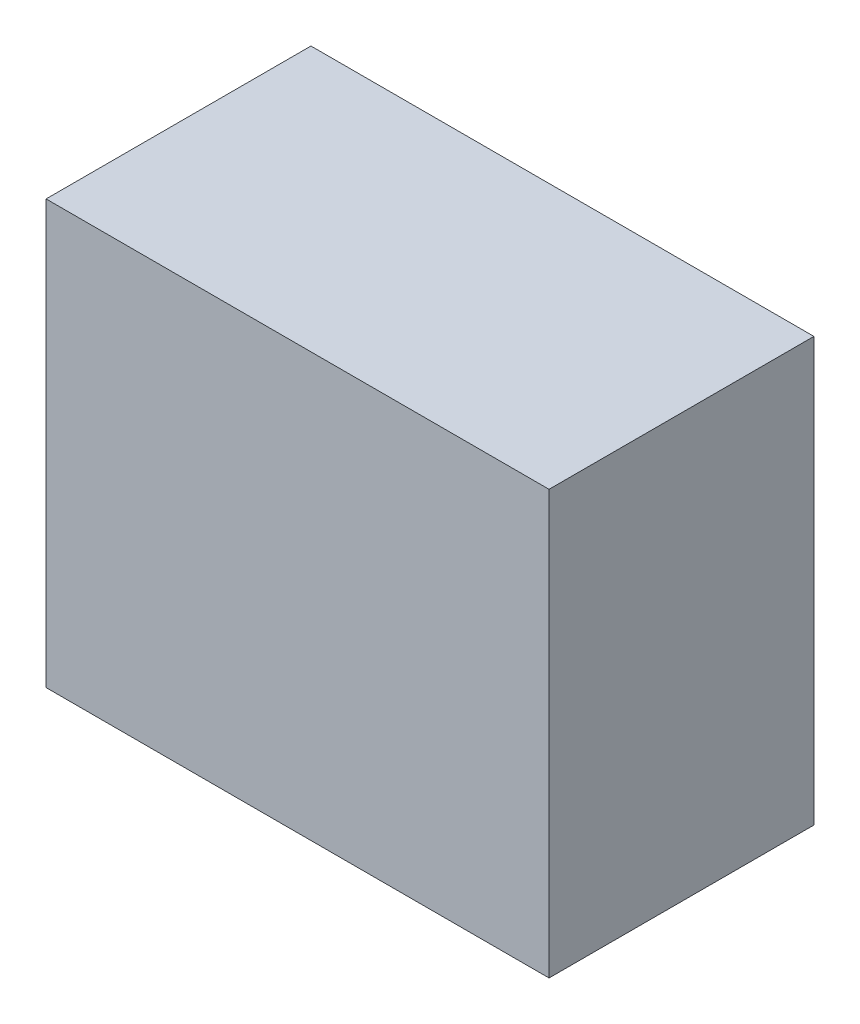
ISO-10303-21;
HEADER;
FILE_DESCRIPTION(('STEP AP214'),'2;1');
FILE_NAME('part.step','',(''),(''),'','','');
FILE_SCHEMA(('AUTOMOTIVE_DESIGN { 1 0 10303 214 1 1 1 1 }'));
ENDSEC;
DATA;
#1=APPLICATION_CONTEXT('core data for automotive mechanical design processes');
#2=APPLICATION_PROTOCOL_DEFINITION('international standard','automotive_design',2000,#1);
#3=PRODUCT_CONTEXT('',#1,'mechanical');
#4=PRODUCT('Part','Part','',(#3));
#5=PRODUCT_RELATED_PRODUCT_CATEGORY('part','',(#4));
#6=PRODUCT_DEFINITION_FORMATION('','',#4);
#7=PRODUCT_DEFINITION_CONTEXT('part definition',#1,'design');
#8=PRODUCT_DEFINITION('design','',#6,#7);
#9=PRODUCT_DEFINITION_SHAPE('','',#8);
#10=(LENGTH_UNIT() NAMED_UNIT(*) SI_UNIT(.MILLI.,.METRE.));
#11=(NAMED_UNIT(*) PLANE_ANGLE_UNIT() SI_UNIT($,.RADIAN.));
#12=(NAMED_UNIT(*) SI_UNIT($,.STERADIAN.) SOLID_ANGLE_UNIT());
#13=UNCERTAINTY_MEASURE_WITH_UNIT(LENGTH_MEASURE(1.E-05),#10,'distance_accuracy_value','');
#14=(GEOMETRIC_REPRESENTATION_CONTEXT(3) GLOBAL_UNCERTAINTY_ASSIGNED_CONTEXT((#13)) GLOBAL_UNIT_ASSIGNED_CONTEXT((#10,
#11,#12)) REPRESENTATION_CONTEXT('',''));
#15=CARTESIAN_POINT('',(0.,0.,0.));
#16=DIRECTION('',(0.,0.,1.));
#17=DIRECTION('',(1.,0.,0.));
#18=AXIS2_PLACEMENT_3D('',#15,#16,#17);
#19=CARTESIAN_POINT('',(-0.47474632,-0.3994912,0.50000154));
#20=DIRECTION('',(0.,0.,1.));
#21=DIRECTION('',(1.,0.,0.));
#22=AXIS2_PLACEMENT_3D('',#19,#20,#21);
#23=PLANE('',#22);
#24=DIRECTION('',(1.,0.,0.));
#25=VECTOR('',#24,1.);
#26=CARTESIAN_POINT('',(-0.47474632,0.3994912,0.50000154));
#27=LINE('',#26,#25);
#28=CARTESIAN_POINT('',(-0.47474632,0.3994912,0.50000154));
#29=VERTEX_POINT('',#28);
#30=CARTESIAN_POINT('',(0.47474632,0.3994912,0.50000154));
#31=VERTEX_POINT('',#30);
#32=EDGE_CURVE('E53',#29,#31,#27,.T.);
#33=ORIENTED_EDGE('',*,*,#32,.F.);
#34=DIRECTION('',(0.,1.,0.));
#35=VECTOR('',#34,1.);
#36=CARTESIAN_POINT('',(-0.47474632,-0.3994912,0.50000154));
#37=LINE('',#36,#35);
#38=CARTESIAN_POINT('',(-0.47474632,-0.3994912,0.50000154));
#39=VERTEX_POINT('',#38);
#40=EDGE_CURVE('E68',#39,#29,#37,.T.);
#41=ORIENTED_EDGE('',*,*,#40,.F.);
#42=DIRECTION('',(1.,0.,0.));
#43=VECTOR('',#42,1.);
#44=CARTESIAN_POINT('',(0.47474632,-0.3994912,0.50000154));
#45=LINE('',#44,#43);
#46=CARTESIAN_POINT('',(0.47474632,-0.3994912,0.50000154));
#47=VERTEX_POINT('',#46);
#48=EDGE_CURVE('E20',#47,#39,#45,.F.);
#49=ORIENTED_EDGE('',*,*,#48,.F.);
#50=DIRECTION('',(0.,1.,0.));
#51=VECTOR('',#50,1.);
#52=CARTESIAN_POINT('',(0.47474632,0.3994912,0.50000154));
#53=LINE('',#52,#51);
#54=EDGE_CURVE('E58',#31,#47,#53,.F.);
#55=ORIENTED_EDGE('',*,*,#54,.F.);
#56=EDGE_LOOP('',(#33,#41,#49,#55));
#57=FACE_BOUND('',#56,.T.);
#58=ADVANCED_FACE('F17',(#57),#23,.T.);
#59=CARTESIAN_POINT('',(0.47474632,-0.3994912,0.));
#60=DIRECTION('',(0.,-1.,0.));
#61=DIRECTION('',(0.,0.,-1.));
#62=AXIS2_PLACEMENT_3D('',#59,#60,#61);
#63=PLANE('',#62);
#64=DIRECTION('',(0.,0.,1.));
#65=VECTOR('',#64,1.);
#66=CARTESIAN_POINT('',(-0.47474632,-0.3994912,0.));
#67=LINE('',#66,#65);
#68=CARTESIAN_POINT('',(-0.47474632,-0.3994912,0.));
#69=VERTEX_POINT('',#68);
#70=EDGE_CURVE('E79',#69,#39,#67,.T.);
#71=ORIENTED_EDGE('',*,*,#70,.F.);
#72=DIRECTION('',(1.,0.,0.));
#73=VECTOR('',#72,1.);
#74=CARTESIAN_POINT('',(-0.47474632,-0.3994912,0.));
#75=LINE('',#74,#73);
#76=CARTESIAN_POINT('',(0.47474632,-0.3994912,0.));
#77=VERTEX_POINT('',#76);
#78=EDGE_CURVE('E74',#69,#77,#75,.T.);
#79=ORIENTED_EDGE('',*,*,#78,.T.);
#80=DIRECTION('',(0.,0.,-1.));
#81=VECTOR('',#80,1.);
#82=CARTESIAN_POINT('',(0.47474632,-0.3994912,0.));
#83=LINE('',#82,#81);
#84=EDGE_CURVE('E63',#47,#77,#83,.T.);
#85=ORIENTED_EDGE('',*,*,#84,.F.);
#86=ORIENTED_EDGE('',*,*,#48,.T.);
#87=EDGE_LOOP('',(#71,#79,#85,#86));
#88=FACE_BOUND('',#87,.T.);
#89=ADVANCED_FACE('F73',(#88),#63,.T.);
#90=CARTESIAN_POINT('',(0.47474632,0.3994912,0.));
#91=DIRECTION('',(1.,0.,0.));
#92=DIRECTION('',(0.,0.,-1.));
#93=AXIS2_PLACEMENT_3D('',#90,#91,#92);
#94=PLANE('',#93);
#95=ORIENTED_EDGE('',*,*,#84,.T.);
#96=DIRECTION('',(0.,1.,0.));
#97=VECTOR('',#96,1.);
#98=CARTESIAN_POINT('',(0.47474632,-0.3994912,0.));
#99=LINE('',#98,#97);
#100=CARTESIAN_POINT('',(0.47474632,0.3994912,0.));
#101=VERTEX_POINT('',#100);
#102=EDGE_CURVE('E84',#77,#101,#99,.T.);
#103=ORIENTED_EDGE('',*,*,#102,.T.);
#104=DIRECTION('',(0.,0.,1.));
#105=VECTOR('',#104,1.);
#106=CARTESIAN_POINT('',(0.47474632,0.3994912,0.));
#107=LINE('',#106,#105);
#108=EDGE_CURVE('E65',#31,#101,#107,.F.);
#109=ORIENTED_EDGE('',*,*,#108,.F.);
#110=ORIENTED_EDGE('',*,*,#54,.T.);
#111=EDGE_LOOP('',(#95,#103,#109,#110));
#112=FACE_BOUND('',#111,.T.);
#113=ADVANCED_FACE('F60',(#112),#94,.T.);
#114=CARTESIAN_POINT('',(-0.47474632,0.3994912,0.));
#115=DIRECTION('',(0.,1.,0.));
#116=DIRECTION('',(0.,0.,1.));
#117=AXIS2_PLACEMENT_3D('',#114,#115,#116);
#118=PLANE('',#117);
#119=ORIENTED_EDGE('',*,*,#108,.T.);
#120=DIRECTION('',(1.,0.,0.));
#121=VECTOR('',#120,1.);
#122=CARTESIAN_POINT('',(-0.47474632,0.3994912,0.));
#123=LINE('',#122,#121);
#124=CARTESIAN_POINT('',(-0.47474632,0.3994912,0.));
#125=VERTEX_POINT('',#124);
#126=EDGE_CURVE('E26',#101,#125,#123,.F.);
#127=ORIENTED_EDGE('',*,*,#126,.T.);
#128=DIRECTION('',(0.,0.,1.));
#129=VECTOR('',#128,1.);
#130=CARTESIAN_POINT('',(-0.47474632,0.3994912,0.));
#131=LINE('',#130,#129);
#132=EDGE_CURVE('E34',#29,#125,#131,.F.);
#133=ORIENTED_EDGE('',*,*,#132,.F.);
#134=ORIENTED_EDGE('',*,*,#32,.T.);
#135=EDGE_LOOP('',(#119,#127,#133,#134));
#136=FACE_BOUND('',#135,.T.);
#137=ADVANCED_FACE('F88',(#136),#118,.T.);
#138=CARTESIAN_POINT('',(-0.47474632,-0.3994912,0.));
#139=DIRECTION('',(-1.,0.,0.));
#140=DIRECTION('',(0.,0.,1.));
#141=AXIS2_PLACEMENT_3D('',#138,#139,#140);
#142=PLANE('',#141);
#143=ORIENTED_EDGE('',*,*,#132,.T.);
#144=DIRECTION('',(0.,1.,0.));
#145=VECTOR('',#144,1.);
#146=CARTESIAN_POINT('',(-0.47474632,-0.3994912,0.));
#147=LINE('',#146,#145);
#148=EDGE_CURVE('E11',#125,#69,#147,.F.);
#149=ORIENTED_EDGE('',*,*,#148,.T.);
#150=ORIENTED_EDGE('',*,*,#70,.T.);
#151=ORIENTED_EDGE('',*,*,#40,.T.);
#152=EDGE_LOOP('',(#143,#149,#150,#151));
#153=FACE_BOUND('',#152,.T.);
#154=ADVANCED_FACE('F91',(#153),#142,.T.);
#155=CARTESIAN_POINT('',(-0.47474632,-0.3994912,0.));
#156=DIRECTION('',(0.,0.,1.));
#157=DIRECTION('',(1.,0.,0.));
#158=AXIS2_PLACEMENT_3D('',#155,#156,#157);
#159=PLANE('',#158);
#160=ORIENTED_EDGE('',*,*,#126,.F.);
#161=ORIENTED_EDGE('',*,*,#102,.F.);
#162=ORIENTED_EDGE('',*,*,#78,.F.);
#163=ORIENTED_EDGE('',*,*,#148,.F.);
#164=EDGE_LOOP('',(#160,#161,#162,#163));
#165=FACE_BOUND('',#164,.T.);
#166=ADVANCED_FACE('F90',(#165),#159,.F.);
#167=CLOSED_SHELL('',(#58,#89,#113,#137,#154,#166));
#168=MANIFOLD_SOLID_BREP('B1',#167);
#169=ADVANCED_BREP_SHAPE_REPRESENTATION('',(#18,#168),#14);
#170=SHAPE_DEFINITION_REPRESENTATION(#9,#169);
ENDSEC;
END-ISO-10303-21;
